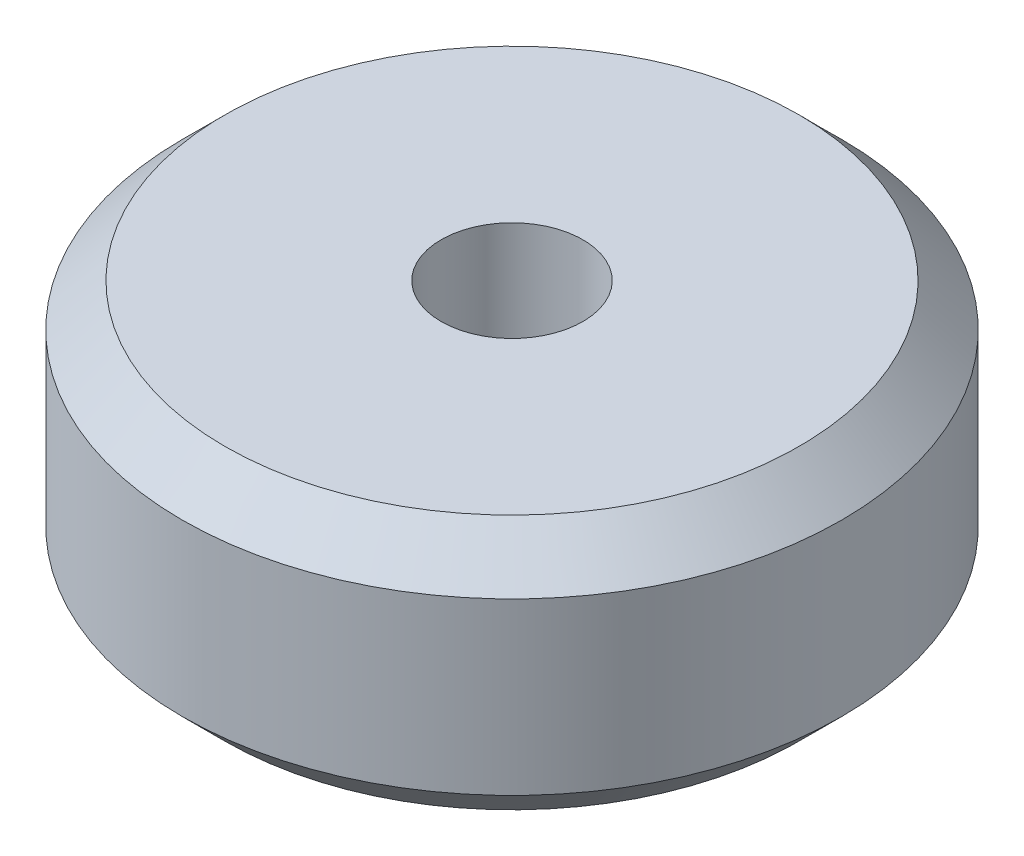
ISO-10303-21;
HEADER;
FILE_DESCRIPTION(('STEP AP214'),'2;1');
FILE_NAME('part.step','',(''),(''),'','','');
FILE_SCHEMA(('AUTOMOTIVE_DESIGN { 1 0 10303 214 1 1 1 1 }'));
ENDSEC;
DATA;
#1=APPLICATION_CONTEXT('core data for automotive mechanical design processes');
#2=APPLICATION_PROTOCOL_DEFINITION('international standard','automotive_design',2000,#1);
#3=PRODUCT_CONTEXT('',#1,'mechanical');
#4=PRODUCT('Part','Part','',(#3));
#5=PRODUCT_RELATED_PRODUCT_CATEGORY('part','',(#4));
#6=PRODUCT_DEFINITION_FORMATION('','',#4);
#7=PRODUCT_DEFINITION_CONTEXT('part definition',#1,'design');
#8=PRODUCT_DEFINITION('design','',#6,#7);
#9=PRODUCT_DEFINITION_SHAPE('','',#8);
#10=(LENGTH_UNIT() NAMED_UNIT(*) SI_UNIT(.MILLI.,.METRE.));
#11=(NAMED_UNIT(*) PLANE_ANGLE_UNIT() SI_UNIT($,.RADIAN.));
#12=(NAMED_UNIT(*) SI_UNIT($,.STERADIAN.) SOLID_ANGLE_UNIT());
#13=UNCERTAINTY_MEASURE_WITH_UNIT(LENGTH_MEASURE(1.E-05),#10,'distance_accuracy_value','');
#14=(GEOMETRIC_REPRESENTATION_CONTEXT(3) GLOBAL_UNCERTAINTY_ASSIGNED_CONTEXT((#13)) GLOBAL_UNIT_ASSIGNED_CONTEXT((#10,
#11,#12)) REPRESENTATION_CONTEXT('',''));
#15=CARTESIAN_POINT('',(0.,0.,0.));
#16=DIRECTION('',(0.,0.,1.));
#17=DIRECTION('',(1.,0.,0.));
#18=AXIS2_PLACEMENT_3D('',#15,#16,#17);
#19=CARTESIAN_POINT('',(0.,9.,0.));
#20=DIRECTION('',(0.,1.,0.));
#21=DIRECTION('',(0.,0.,1.));
#22=AXIS2_PLACEMENT_3D('',#19,#20,#21);
#23=PLANE('',#22);
#24=CARTESIAN_POINT('',(0.,9.,0.));
#25=DIRECTION('',(0.,1.,0.));
#26=DIRECTION('',(0.,0.,1.));
#27=AXIS2_PLACEMENT_3D('',#24,#25,#26);
#28=CIRCLE('',#27,10.125);
#29=CARTESIAN_POINT('',(0.,9.,10.125));
#30=VERTEX_POINT('',#29);
#31=EDGE_CURVE('E10',#30,#30,#28,.T.);
#32=ORIENTED_EDGE('',*,*,#31,.T.);
#33=EDGE_LOOP('',(#32));
#34=FACE_BOUND('',#33,.T.);
#35=CARTESIAN_POINT('',(0.,9.,0.));
#36=DIRECTION('',(0.,1.,0.));
#37=DIRECTION('',(0.,0.,1.));
#38=AXIS2_PLACEMENT_3D('',#35,#36,#37);
#39=CIRCLE('',#38,2.5);
#40=CARTESIAN_POINT('',(0.,9.,2.5));
#41=VERTEX_POINT('',#40);
#42=EDGE_CURVE('E62',#41,#41,#39,.T.);
#43=ORIENTED_EDGE('',*,*,#42,.F.);
#44=EDGE_LOOP('',(#43));
#45=FACE_BOUND('',#44,.T.);
#46=ADVANCED_FACE('F41',(#34,#45),#23,.T.);
#47=CARTESIAN_POINT('',(0.,0.,0.));
#48=DIRECTION('',(0.,1.,0.));
#49=DIRECTION('',(0.,0.,1.));
#50=AXIS2_PLACEMENT_3D('',#47,#48,#49);
#51=PLANE('',#50);
#52=CARTESIAN_POINT('',(0.,0.,0.));
#53=DIRECTION('',(0.,1.,0.));
#54=DIRECTION('',(0.,0.,1.));
#55=AXIS2_PLACEMENT_3D('',#52,#53,#54);
#56=CIRCLE('',#55,10.125);
#57=CARTESIAN_POINT('',(0.,0.,10.125));
#58=VERTEX_POINT('',#57);
#59=EDGE_CURVE('E49',#58,#58,#56,.F.);
#60=ORIENTED_EDGE('',*,*,#59,.T.);
#61=EDGE_LOOP('',(#60));
#62=FACE_BOUND('',#61,.T.);
#63=CARTESIAN_POINT('',(0.,0.,0.));
#64=DIRECTION('',(0.,1.,0.));
#65=DIRECTION('',(0.,0.,1.));
#66=AXIS2_PLACEMENT_3D('',#63,#64,#65);
#67=CIRCLE('',#66,2.5);
#68=CARTESIAN_POINT('',(0.,0.,2.5));
#69=VERTEX_POINT('',#68);
#70=EDGE_CURVE('E63',#69,#69,#67,.T.);
#71=ORIENTED_EDGE('',*,*,#70,.T.);
#72=EDGE_LOOP('',(#71));
#73=FACE_BOUND('',#72,.T.);
#74=ADVANCED_FACE('F73',(#62,#73),#51,.F.);
#75=CARTESIAN_POINT('',(0.,9.,0.));
#76=DIRECTION('',(0.,-1.,0.));
#77=DIRECTION('',(0.,0.,-1.));
#78=AXIS2_PLACEMENT_3D('',#75,#76,#77);
#79=CYLINDRICAL_SURFACE('',#78,11.625);
#80=CARTESIAN_POINT('',(0.,1.50000000000001,0.));
#81=DIRECTION('',(0.,1.,0.));
#82=DIRECTION('',(0.,0.,1.));
#83=AXIS2_PLACEMENT_3D('',#80,#81,#82);
#84=CIRCLE('',#83,11.625);
#85=CARTESIAN_POINT('',(0.,1.50000000000001,11.625));
#86=VERTEX_POINT('',#85);
#87=EDGE_CURVE('E53',#86,#86,#84,.T.);
#88=ORIENTED_EDGE('',*,*,#87,.T.);
#89=EDGE_LOOP('',(#88));
#90=FACE_BOUND('',#89,.T.);
#91=CARTESIAN_POINT('',(0.,7.49999999999999,0.));
#92=DIRECTION('',(0.,1.,0.));
#93=DIRECTION('',(0.,0.,1.));
#94=AXIS2_PLACEMENT_3D('',#91,#92,#93);
#95=CIRCLE('',#94,11.625);
#96=CARTESIAN_POINT('',(0.,7.49999999999999,11.625));
#97=VERTEX_POINT('',#96);
#98=EDGE_CURVE('E57',#97,#97,#95,.F.);
#99=ORIENTED_EDGE('',*,*,#98,.T.);
#100=EDGE_LOOP('',(#99));
#101=FACE_BOUND('',#100,.T.);
#102=ADVANCED_FACE('F79',(#90,#101),#79,.T.);
#103=CARTESIAN_POINT('',(0.,9.,0.));
#104=DIRECTION('',(0.,-1.,0.));
#105=DIRECTION('',(0.,0.,-1.));
#106=AXIS2_PLACEMENT_3D('',#103,#104,#105);
#107=CYLINDRICAL_SURFACE('',#106,2.5);
#108=ORIENTED_EDGE('',*,*,#42,.T.);
#109=EDGE_LOOP('',(#108));
#110=FACE_BOUND('',#109,.T.);
#111=ORIENTED_EDGE('',*,*,#70,.F.);
#112=EDGE_LOOP('',(#111));
#113=FACE_BOUND('',#112,.T.);
#114=ADVANCED_FACE('F69',(#110,#113),#107,.F.);
#115=CARTESIAN_POINT('',(0.,1.50000000000001,0.));
#116=DIRECTION('',(0.,1.,0.));
#117=DIRECTION('',(0.,0.,1.));
#118=AXIS2_PLACEMENT_3D('',#115,#116,#117);
#119=CONICAL_SURFACE('',#118,11.625,0.785398163397451);
#120=ORIENTED_EDGE('',*,*,#59,.F.);
#121=EDGE_LOOP('',(#120));
#122=FACE_BOUND('',#121,.T.);
#123=ORIENTED_EDGE('',*,*,#87,.F.);
#124=EDGE_LOOP('',(#123));
#125=FACE_BOUND('',#124,.T.);
#126=ADVANCED_FACE('F86',(#122,#125),#119,.T.);
#127=CARTESIAN_POINT('',(0.,9.,0.));
#128=DIRECTION('',(0.,-1.,0.));
#129=DIRECTION('',(0.,0.,-1.));
#130=AXIS2_PLACEMENT_3D('',#127,#128,#129);
#131=CONICAL_SURFACE('',#130,10.125,0.785398163397447);
#132=ORIENTED_EDGE('',*,*,#98,.F.);
#133=EDGE_LOOP('',(#132));
#134=FACE_BOUND('',#133,.T.);
#135=ORIENTED_EDGE('',*,*,#31,.F.);
#136=EDGE_LOOP('',(#135));
#137=FACE_BOUND('',#136,.T.);
#138=ADVANCED_FACE('F44',(#134,#137),#131,.T.);
#139=CLOSED_SHELL('',(#46,#74,#102,#114,#126,#138));
#140=MANIFOLD_SOLID_BREP('B2',#139);
#141=ADVANCED_BREP_SHAPE_REPRESENTATION('',(#18,#140),#14);
#142=SHAPE_DEFINITION_REPRESENTATION(#9,#141);
ENDSEC;
END-ISO-10303-21;
